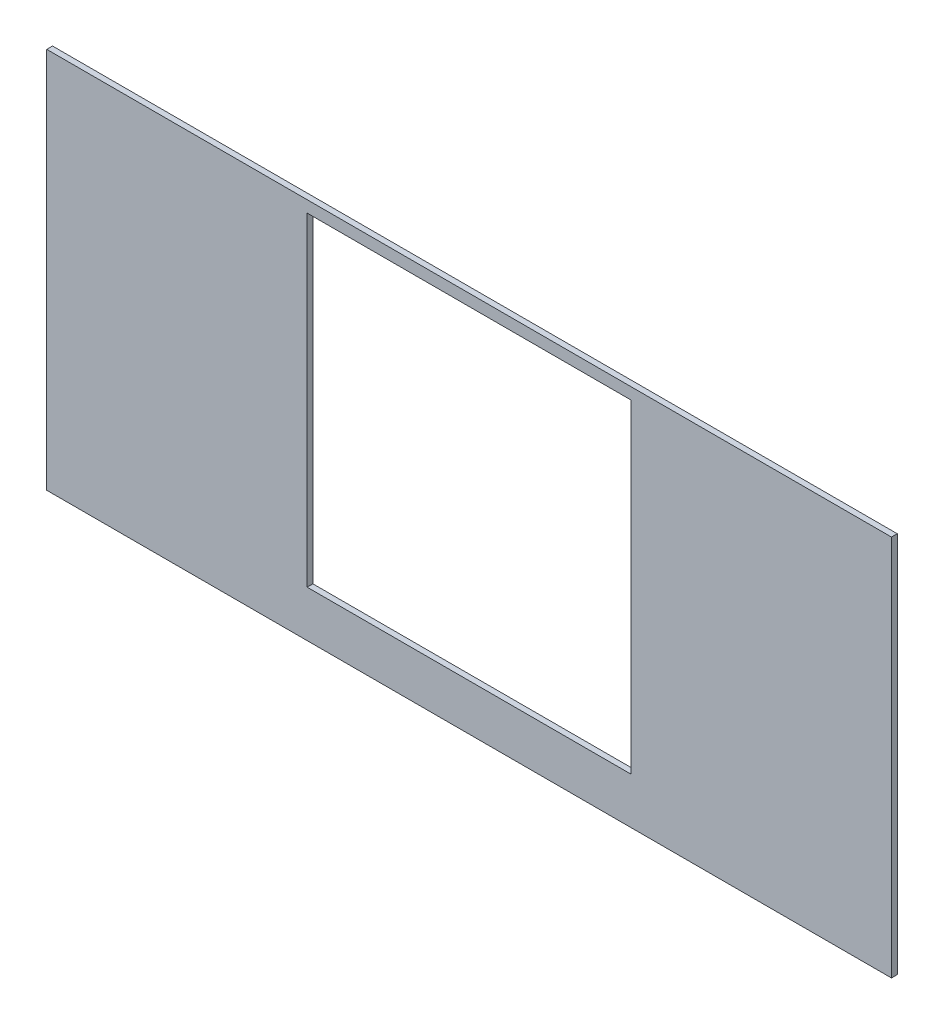
ISO-10303-21;
HEADER;
FILE_DESCRIPTION(('STEP AP214'),'2;1');
FILE_NAME('part.step','',(''),(''),'','','');
FILE_SCHEMA(('AUTOMOTIVE_DESIGN { 1 0 10303 214 1 1 1 1 }'));
ENDSEC;
DATA;
#1=APPLICATION_CONTEXT('core data for automotive mechanical design processes');
#2=APPLICATION_PROTOCOL_DEFINITION('international standard','automotive_design',2000,#1);
#3=PRODUCT_CONTEXT('',#1,'mechanical');
#4=PRODUCT('Part','Part','',(#3));
#5=PRODUCT_RELATED_PRODUCT_CATEGORY('part','',(#4));
#6=PRODUCT_DEFINITION_FORMATION('','',#4);
#7=PRODUCT_DEFINITION_CONTEXT('part definition',#1,'design');
#8=PRODUCT_DEFINITION('design','',#6,#7);
#9=PRODUCT_DEFINITION_SHAPE('','',#8);
#10=(LENGTH_UNIT() NAMED_UNIT(*) SI_UNIT(.MILLI.,.METRE.));
#11=(NAMED_UNIT(*) PLANE_ANGLE_UNIT() SI_UNIT($,.RADIAN.));
#12=(NAMED_UNIT(*) SI_UNIT($,.STERADIAN.) SOLID_ANGLE_UNIT());
#13=UNCERTAINTY_MEASURE_WITH_UNIT(LENGTH_MEASURE(1.E-05),#10,'distance_accuracy_value','');
#14=(GEOMETRIC_REPRESENTATION_CONTEXT(3) GLOBAL_UNCERTAINTY_ASSIGNED_CONTEXT((#13)) GLOBAL_UNIT_ASSIGNED_CONTEXT((#10,
#11,#12)) REPRESENTATION_CONTEXT('',''));
#15=CARTESIAN_POINT('',(0.,0.,0.));
#16=DIRECTION('',(0.,0.,1.));
#17=DIRECTION('',(1.,0.,0.));
#18=AXIS2_PLACEMENT_3D('',#15,#16,#17);
#19=CARTESIAN_POINT('',(365.,-165.,5.));
#20=DIRECTION('',(-1.,0.,0.));
#21=DIRECTION('',(0.,0.,1.));
#22=AXIS2_PLACEMENT_3D('',#19,#20,#21);
#23=PLANE('',#22);
#24=DIRECTION('',(0.,1.,0.));
#25=VECTOR('',#24,1.);
#26=CARTESIAN_POINT('',(365.,-165.,0.));
#27=LINE('',#26,#25);
#28=CARTESIAN_POINT('',(365.,-165.,0.));
#29=VERTEX_POINT('',#28);
#30=CARTESIAN_POINT('',(365.,165.,0.));
#31=VERTEX_POINT('',#30);
#32=EDGE_CURVE('E134',#29,#31,#27,.T.);
#33=ORIENTED_EDGE('',*,*,#32,.T.);
#34=DIRECTION('',(0.,0.,-1.));
#35=VECTOR('',#34,1.);
#36=CARTESIAN_POINT('',(365.,165.,5.));
#37=LINE('',#36,#35);
#38=CARTESIAN_POINT('',(365.,165.,5.));
#39=VERTEX_POINT('',#38);
#40=EDGE_CURVE('E11',#39,#31,#37,.T.);
#41=ORIENTED_EDGE('',*,*,#40,.F.);
#42=DIRECTION('',(0.,1.,0.));
#43=VECTOR('',#42,1.);
#44=CARTESIAN_POINT('',(365.,-165.,5.));
#45=LINE('',#44,#43);
#46=CARTESIAN_POINT('',(365.,-165.,5.));
#47=VERTEX_POINT('',#46);
#48=EDGE_CURVE('E135',#47,#39,#45,.T.);
#49=ORIENTED_EDGE('',*,*,#48,.F.);
#50=DIRECTION('',(0.,0.,-1.));
#51=VECTOR('',#50,1.);
#52=CARTESIAN_POINT('',(365.,-165.,5.));
#53=LINE('',#52,#51);
#54=EDGE_CURVE('E145',#47,#29,#53,.T.);
#55=ORIENTED_EDGE('',*,*,#54,.T.);
#56=EDGE_LOOP('',(#33,#41,#49,#55));
#57=FACE_BOUND('',#56,.T.);
#58=ADVANCED_FACE('F33',(#57),#23,.F.);
#59=CARTESIAN_POINT('',(-365.,165.,5.));
#60=DIRECTION('',(0.,-1.,0.));
#61=DIRECTION('',(0.,0.,-1.));
#62=AXIS2_PLACEMENT_3D('',#59,#60,#61);
#63=PLANE('',#62);
#64=DIRECTION('',(-1.,0.,0.));
#65=VECTOR('',#64,1.);
#66=CARTESIAN_POINT('',(-365.,165.,0.));
#67=LINE('',#66,#65);
#68=CARTESIAN_POINT('',(-365.,165.,0.));
#69=VERTEX_POINT('',#68);
#70=EDGE_CURVE('E148',#31,#69,#67,.T.);
#71=ORIENTED_EDGE('',*,*,#70,.T.);
#72=DIRECTION('',(0.,0.,-1.));
#73=VECTOR('',#72,1.);
#74=CARTESIAN_POINT('',(-365.,165.,5.));
#75=LINE('',#74,#73);
#76=CARTESIAN_POINT('',(-365.,165.,5.));
#77=VERTEX_POINT('',#76);
#78=EDGE_CURVE('E40',#77,#69,#75,.T.);
#79=ORIENTED_EDGE('',*,*,#78,.F.);
#80=DIRECTION('',(-1.,0.,0.));
#81=VECTOR('',#80,1.);
#82=CARTESIAN_POINT('',(-365.,165.,5.));
#83=LINE('',#82,#81);
#84=EDGE_CURVE('E138',#39,#77,#83,.T.);
#85=ORIENTED_EDGE('',*,*,#84,.F.);
#86=ORIENTED_EDGE('',*,*,#40,.T.);
#87=EDGE_LOOP('',(#71,#79,#85,#86));
#88=FACE_BOUND('',#87,.T.);
#89=ADVANCED_FACE('F176',(#88),#63,.F.);
#90=CARTESIAN_POINT('',(-365.,-165.,5.));
#91=DIRECTION('',(1.,0.,0.));
#92=DIRECTION('',(0.,0.,-1.));
#93=AXIS2_PLACEMENT_3D('',#90,#91,#92);
#94=PLANE('',#93);
#95=DIRECTION('',(0.,-1.,0.));
#96=VECTOR('',#95,1.);
#97=CARTESIAN_POINT('',(-365.,-165.,0.));
#98=LINE('',#97,#96);
#99=CARTESIAN_POINT('',(-365.,-165.,0.));
#100=VERTEX_POINT('',#99);
#101=EDGE_CURVE('E150',#69,#100,#98,.T.);
#102=ORIENTED_EDGE('',*,*,#101,.T.);
#103=DIRECTION('',(0.,0.,-1.));
#104=VECTOR('',#103,1.);
#105=CARTESIAN_POINT('',(-365.,-165.,5.));
#106=LINE('',#105,#104);
#107=CARTESIAN_POINT('',(-365.,-165.,5.));
#108=VERTEX_POINT('',#107);
#109=EDGE_CURVE('E155',#108,#100,#106,.T.);
#110=ORIENTED_EDGE('',*,*,#109,.F.);
#111=DIRECTION('',(0.,-1.,0.));
#112=VECTOR('',#111,1.);
#113=CARTESIAN_POINT('',(-365.,-165.,5.));
#114=LINE('',#113,#112);
#115=EDGE_CURVE('E141',#77,#108,#114,.T.);
#116=ORIENTED_EDGE('',*,*,#115,.F.);
#117=ORIENTED_EDGE('',*,*,#78,.T.);
#118=EDGE_LOOP('',(#102,#110,#116,#117));
#119=FACE_BOUND('',#118,.T.);
#120=ADVANCED_FACE('F162',(#119),#94,.F.);
#121=CARTESIAN_POINT('',(-365.,-165.,5.));
#122=DIRECTION('',(0.,1.,0.));
#123=DIRECTION('',(0.,0.,1.));
#124=AXIS2_PLACEMENT_3D('',#121,#122,#123);
#125=PLANE('',#124);
#126=DIRECTION('',(1.,0.,0.));
#127=VECTOR('',#126,1.);
#128=CARTESIAN_POINT('',(-365.,-165.,0.));
#129=LINE('',#128,#127);
#130=EDGE_CURVE('E139',#100,#29,#129,.T.);
#131=ORIENTED_EDGE('',*,*,#130,.T.);
#132=ORIENTED_EDGE('',*,*,#54,.F.);
#133=DIRECTION('',(1.,0.,0.));
#134=VECTOR('',#133,1.);
#135=CARTESIAN_POINT('',(-365.,-165.,5.));
#136=LINE('',#135,#134);
#137=EDGE_CURVE('E143',#108,#47,#136,.T.);
#138=ORIENTED_EDGE('',*,*,#137,.F.);
#139=ORIENTED_EDGE('',*,*,#109,.T.);
#140=EDGE_LOOP('',(#131,#132,#138,#139));
#141=FACE_BOUND('',#140,.T.);
#142=ADVANCED_FACE('F169',(#141),#125,.F.);
#143=CARTESIAN_POINT('',(0.,0.,5.));
#144=DIRECTION('',(0.,0.,-1.));
#145=DIRECTION('',(-1.,0.,0.));
#146=AXIS2_PLACEMENT_3D('',#143,#144,#145);
#147=PLANE('',#146);
#148=DIRECTION('',(0.,-1.,0.));
#149=VECTOR('',#148,1.);
#150=CARTESIAN_POINT('',(-140.,155.,5.));
#151=LINE('',#150,#149);
#152=CARTESIAN_POINT('',(-140.,155.,5.));
#153=VERTEX_POINT('',#152);
#154=CARTESIAN_POINT('',(-140.,-125.,5.));
#155=VERTEX_POINT('',#154);
#156=EDGE_CURVE('E121',#153,#155,#151,.T.);
#157=ORIENTED_EDGE('',*,*,#156,.F.);
#158=DIRECTION('',(-1.,0.,0.));
#159=VECTOR('',#158,1.);
#160=CARTESIAN_POINT('',(140.,155.,5.));
#161=LINE('',#160,#159);
#162=CARTESIAN_POINT('',(140.,155.,5.));
#163=VERTEX_POINT('',#162);
#164=EDGE_CURVE('E114',#163,#153,#161,.T.);
#165=ORIENTED_EDGE('',*,*,#164,.F.);
#166=DIRECTION('',(0.,1.,0.));
#167=VECTOR('',#166,1.);
#168=CARTESIAN_POINT('',(140.,155.,5.));
#169=LINE('',#168,#167);
#170=CARTESIAN_POINT('',(140.,-125.,5.));
#171=VERTEX_POINT('',#170);
#172=EDGE_CURVE('E125',#171,#163,#169,.T.);
#173=ORIENTED_EDGE('',*,*,#172,.F.);
#174=DIRECTION('',(1.,0.,0.));
#175=VECTOR('',#174,1.);
#176=CARTESIAN_POINT('',(140.,-125.,5.));
#177=LINE('',#176,#175);
#178=EDGE_CURVE('E47',#155,#171,#177,.T.);
#179=ORIENTED_EDGE('',*,*,#178,.F.);
#180=EDGE_LOOP('',(#157,#165,#173,#179));
#181=FACE_BOUND('',#180,.T.);
#182=ORIENTED_EDGE('',*,*,#48,.T.);
#183=ORIENTED_EDGE('',*,*,#84,.T.);
#184=ORIENTED_EDGE('',*,*,#115,.T.);
#185=ORIENTED_EDGE('',*,*,#137,.T.);
#186=EDGE_LOOP('',(#182,#183,#184,#185));
#187=FACE_BOUND('',#186,.T.);
#188=ADVANCED_FACE('F175',(#181,#187),#147,.F.);
#189=CARTESIAN_POINT('',(0.,0.,0.));
#190=DIRECTION('',(0.,0.,-1.));
#191=DIRECTION('',(-1.,0.,0.));
#192=AXIS2_PLACEMENT_3D('',#189,#190,#191);
#193=PLANE('',#192);
#194=DIRECTION('',(-1.,0.,0.));
#195=VECTOR('',#194,1.);
#196=CARTESIAN_POINT('',(140.,155.,0.));
#197=LINE('',#196,#195);
#198=CARTESIAN_POINT('',(140.,155.,0.));
#199=VERTEX_POINT('',#198);
#200=CARTESIAN_POINT('',(-140.,155.,0.));
#201=VERTEX_POINT('',#200);
#202=EDGE_CURVE('E111',#199,#201,#197,.T.);
#203=ORIENTED_EDGE('',*,*,#202,.T.);
#204=DIRECTION('',(0.,-1.,0.));
#205=VECTOR('',#204,1.);
#206=CARTESIAN_POINT('',(-140.,155.,0.));
#207=LINE('',#206,#205);
#208=CARTESIAN_POINT('',(-140.,-125.,0.));
#209=VERTEX_POINT('',#208);
#210=EDGE_CURVE('E98',#201,#209,#207,.T.);
#211=ORIENTED_EDGE('',*,*,#210,.T.);
#212=DIRECTION('',(1.,0.,0.));
#213=VECTOR('',#212,1.);
#214=CARTESIAN_POINT('',(140.,-125.,0.));
#215=LINE('',#214,#213);
#216=CARTESIAN_POINT('',(140.,-125.,0.));
#217=VERTEX_POINT('',#216);
#218=EDGE_CURVE('E129',#209,#217,#215,.T.);
#219=ORIENTED_EDGE('',*,*,#218,.T.);
#220=DIRECTION('',(0.,1.,0.));
#221=VECTOR('',#220,1.);
#222=CARTESIAN_POINT('',(140.,155.,0.));
#223=LINE('',#222,#221);
#224=EDGE_CURVE('E119',#217,#199,#223,.T.);
#225=ORIENTED_EDGE('',*,*,#224,.T.);
#226=EDGE_LOOP('',(#203,#211,#219,#225));
#227=FACE_BOUND('',#226,.T.);
#228=ORIENTED_EDGE('',*,*,#32,.F.);
#229=ORIENTED_EDGE('',*,*,#130,.F.);
#230=ORIENTED_EDGE('',*,*,#101,.F.);
#231=ORIENTED_EDGE('',*,*,#70,.F.);
#232=EDGE_LOOP('',(#228,#229,#230,#231));
#233=FACE_BOUND('',#232,.T.);
#234=ADVANCED_FACE('F117',(#227,#233),#193,.T.);
#235=CARTESIAN_POINT('',(140.,155.,-395.979797464467));
#236=DIRECTION('',(0.,1.,0.));
#237=DIRECTION('',(0.,0.,1.));
#238=AXIS2_PLACEMENT_3D('',#235,#236,#237);
#239=PLANE('',#238);
#240=DIRECTION('',(0.,0.,1.));
#241=VECTOR('',#240,1.);
#242=CARTESIAN_POINT('',(140.,155.,-395.979797464467));
#243=LINE('',#242,#241);
#244=EDGE_CURVE('E55',#199,#163,#243,.T.);
#245=ORIENTED_EDGE('',*,*,#244,.T.);
#246=ORIENTED_EDGE('',*,*,#164,.T.);
#247=DIRECTION('',(0.,0.,1.));
#248=VECTOR('',#247,1.);
#249=CARTESIAN_POINT('',(-140.,155.,-395.979797464467));
#250=LINE('',#249,#248);
#251=EDGE_CURVE('E102',#201,#153,#250,.T.);
#252=ORIENTED_EDGE('',*,*,#251,.F.);
#253=ORIENTED_EDGE('',*,*,#202,.F.);
#254=EDGE_LOOP('',(#245,#246,#252,#253));
#255=FACE_BOUND('',#254,.T.);
#256=ADVANCED_FACE('F110',(#255),#239,.F.);
#257=CARTESIAN_POINT('',(-140.,155.,-395.979797464467));
#258=DIRECTION('',(-1.,0.,0.));
#259=DIRECTION('',(0.,-1.,0.));
#260=AXIS2_PLACEMENT_3D('',#257,#258,#259);
#261=PLANE('',#260);
#262=ORIENTED_EDGE('',*,*,#251,.T.);
#263=ORIENTED_EDGE('',*,*,#156,.T.);
#264=DIRECTION('',(0.,0.,1.));
#265=VECTOR('',#264,1.);
#266=CARTESIAN_POINT('',(-140.,-125.,-395.979797464467));
#267=LINE('',#266,#265);
#268=EDGE_CURVE('E104',#209,#155,#267,.T.);
#269=ORIENTED_EDGE('',*,*,#268,.F.);
#270=ORIENTED_EDGE('',*,*,#210,.F.);
#271=EDGE_LOOP('',(#262,#263,#269,#270));
#272=FACE_BOUND('',#271,.T.);
#273=ADVANCED_FACE('F100',(#272),#261,.F.);
#274=CARTESIAN_POINT('',(140.,-125.,-395.979797464467));
#275=DIRECTION('',(0.,-1.,0.));
#276=DIRECTION('',(0.,0.,-1.));
#277=AXIS2_PLACEMENT_3D('',#274,#275,#276);
#278=PLANE('',#277);
#279=ORIENTED_EDGE('',*,*,#268,.T.);
#280=ORIENTED_EDGE('',*,*,#178,.T.);
#281=DIRECTION('',(0.,0.,1.));
#282=VECTOR('',#281,1.);
#283=CARTESIAN_POINT('',(140.,-125.,-395.979797464467));
#284=LINE('',#283,#282);
#285=EDGE_CURVE('E128',#217,#171,#284,.T.);
#286=ORIENTED_EDGE('',*,*,#285,.F.);
#287=ORIENTED_EDGE('',*,*,#218,.F.);
#288=EDGE_LOOP('',(#279,#280,#286,#287));
#289=FACE_BOUND('',#288,.T.);
#290=ADVANCED_FACE('F195',(#289),#278,.F.);
#291=CARTESIAN_POINT('',(140.,155.,-395.979797464467));
#292=DIRECTION('',(1.,0.,0.));
#293=DIRECTION('',(0.,1.,0.));
#294=AXIS2_PLACEMENT_3D('',#291,#292,#293);
#295=PLANE('',#294);
#296=ORIENTED_EDGE('',*,*,#285,.T.);
#297=ORIENTED_EDGE('',*,*,#172,.T.);
#298=ORIENTED_EDGE('',*,*,#244,.F.);
#299=ORIENTED_EDGE('',*,*,#224,.F.);
#300=EDGE_LOOP('',(#296,#297,#298,#299));
#301=FACE_BOUND('',#300,.T.);
#302=ADVANCED_FACE('F198',(#301),#295,.F.);
#303=CLOSED_SHELL('',(#58,#89,#120,#142,#188,#234,#256,#273,#290,#302));
#304=MANIFOLD_SOLID_BREP('B2',#303);
#305=ADVANCED_BREP_SHAPE_REPRESENTATION('',(#18,#304),#14);
#306=SHAPE_DEFINITION_REPRESENTATION(#9,#305);
ENDSEC;
END-ISO-10303-21;
